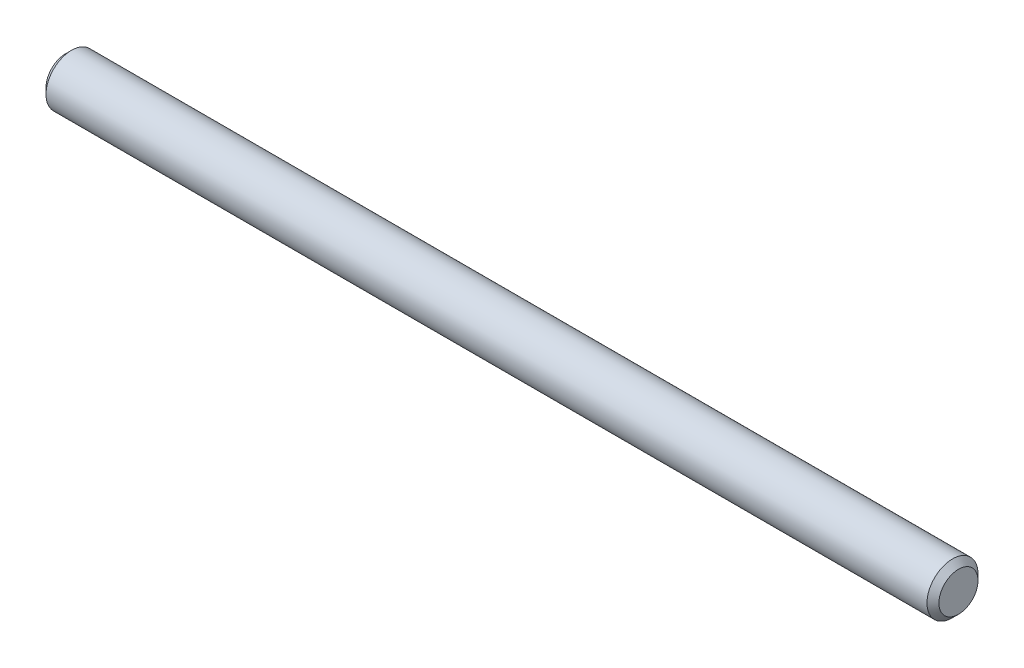
ISO-10303-21;
HEADER;
FILE_DESCRIPTION(('STEP AP214'),'2;1');
FILE_NAME('part.step','',(''),(''),'','','');
FILE_SCHEMA(('AUTOMOTIVE_DESIGN { 1 0 10303 214 1 1 1 1 }'));
ENDSEC;
DATA;
#1=APPLICATION_CONTEXT('core data for automotive mechanical design processes');
#2=APPLICATION_PROTOCOL_DEFINITION('international standard','automotive_design',2000,#1);
#3=PRODUCT_CONTEXT('',#1,'mechanical');
#4=PRODUCT('Part','Part','',(#3));
#5=PRODUCT_RELATED_PRODUCT_CATEGORY('part','',(#4));
#6=PRODUCT_DEFINITION_FORMATION('','',#4);
#7=PRODUCT_DEFINITION_CONTEXT('part definition',#1,'design');
#8=PRODUCT_DEFINITION('design','',#6,#7);
#9=PRODUCT_DEFINITION_SHAPE('','',#8);
#10=(LENGTH_UNIT() NAMED_UNIT(*) SI_UNIT(.MILLI.,.METRE.));
#11=(NAMED_UNIT(*) PLANE_ANGLE_UNIT() SI_UNIT($,.RADIAN.));
#12=(NAMED_UNIT(*) SI_UNIT($,.STERADIAN.) SOLID_ANGLE_UNIT());
#13=UNCERTAINTY_MEASURE_WITH_UNIT(LENGTH_MEASURE(1.E-05),#10,'distance_accuracy_value','');
#14=(GEOMETRIC_REPRESENTATION_CONTEXT(3) GLOBAL_UNCERTAINTY_ASSIGNED_CONTEXT((#13)) GLOBAL_UNIT_ASSIGNED_CONTEXT((#10,
#11,#12)) REPRESENTATION_CONTEXT('',''));
#15=CARTESIAN_POINT('',(0.,0.,0.));
#16=DIRECTION('',(0.,0.,1.));
#17=DIRECTION('',(1.,0.,0.));
#18=AXIS2_PLACEMENT_3D('',#15,#16,#17);
#19=CARTESIAN_POINT('',(-70.,0.,0.));
#20=DIRECTION('',(1.,0.,0.));
#21=DIRECTION('',(0.,0.,-1.));
#22=AXIS2_PLACEMENT_3D('',#19,#20,#21);
#23=CYLINDRICAL_SURFACE('',#22,4.);
#24=CARTESIAN_POINT('',(-69.0625,0.,0.));
#25=DIRECTION('',(1.,0.,0.));
#26=DIRECTION('',(0.,0.,-1.));
#27=AXIS2_PLACEMENT_3D('',#24,#25,#26);
#28=CIRCLE('',#27,4.);
#29=CARTESIAN_POINT('',(-69.0625,0.,-4.));
#30=VERTEX_POINT('',#29);
#31=EDGE_CURVE('E46',#30,#30,#28,.T.);
#32=ORIENTED_EDGE('',*,*,#31,.T.);
#33=EDGE_LOOP('',(#32));
#34=FACE_BOUND('',#33,.T.);
#35=CARTESIAN_POINT('',(69.0625,0.,0.));
#36=DIRECTION('',(1.,0.,0.));
#37=DIRECTION('',(0.,0.,-1.));
#38=AXIS2_PLACEMENT_3D('',#35,#36,#37);
#39=CIRCLE('',#38,4.);
#40=CARTESIAN_POINT('',(69.0625,0.,-4.));
#41=VERTEX_POINT('',#40);
#42=EDGE_CURVE('E50',#41,#41,#39,.F.);
#43=ORIENTED_EDGE('',*,*,#42,.T.);
#44=EDGE_LOOP('',(#43));
#45=FACE_BOUND('',#44,.T.);
#46=ADVANCED_FACE('F35',(#34,#45),#23,.T.);
#47=CARTESIAN_POINT('',(-70.,0.,0.));
#48=DIRECTION('',(1.,0.,0.));
#49=DIRECTION('',(0.,0.,-1.));
#50=AXIS2_PLACEMENT_3D('',#47,#48,#49);
#51=PLANE('',#50);
#52=CARTESIAN_POINT('',(-70.,0.,0.));
#53=DIRECTION('',(1.,0.,0.));
#54=DIRECTION('',(0.,0.,-1.));
#55=AXIS2_PLACEMENT_3D('',#52,#53,#54);
#56=CIRCLE('',#55,3.06250000000001);
#57=CARTESIAN_POINT('',(-70.,0.,-3.06250000000001));
#58=VERTEX_POINT('',#57);
#59=EDGE_CURVE('E42',#58,#58,#56,.F.);
#60=ORIENTED_EDGE('',*,*,#59,.T.);
#61=EDGE_LOOP('',(#60));
#62=FACE_BOUND('',#61,.T.);
#63=ADVANCED_FACE('F66',(#62),#51,.F.);
#64=CARTESIAN_POINT('',(70.,0.,0.));
#65=DIRECTION('',(1.,0.,0.));
#66=DIRECTION('',(0.,0.,-1.));
#67=AXIS2_PLACEMENT_3D('',#64,#65,#66);
#68=PLANE('',#67);
#69=CARTESIAN_POINT('',(70.,0.,0.));
#70=DIRECTION('',(1.,0.,0.));
#71=DIRECTION('',(0.,0.,-1.));
#72=AXIS2_PLACEMENT_3D('',#69,#70,#71);
#73=CIRCLE('',#72,3.06250000000001);
#74=CARTESIAN_POINT('',(70.,0.,-3.06250000000001));
#75=VERTEX_POINT('',#74);
#76=EDGE_CURVE('E10',#75,#75,#73,.T.);
#77=ORIENTED_EDGE('',*,*,#76,.T.);
#78=EDGE_LOOP('',(#77));
#79=FACE_BOUND('',#78,.T.);
#80=ADVANCED_FACE('F63',(#79),#68,.T.);
#81=CARTESIAN_POINT('',(-69.0625,0.,0.));
#82=DIRECTION('',(1.,0.,0.));
#83=DIRECTION('',(0.,0.,-1.));
#84=AXIS2_PLACEMENT_3D('',#81,#82,#83);
#85=CONICAL_SURFACE('',#84,4.,0.785398163397446);
#86=ORIENTED_EDGE('',*,*,#59,.F.);
#87=EDGE_LOOP('',(#86));
#88=FACE_BOUND('',#87,.T.);
#89=ORIENTED_EDGE('',*,*,#31,.F.);
#90=EDGE_LOOP('',(#89));
#91=FACE_BOUND('',#90,.T.);
#92=ADVANCED_FACE('F59',(#88,#91),#85,.T.);
#93=CARTESIAN_POINT('',(70.,0.,0.));
#94=DIRECTION('',(-1.,0.,0.));
#95=DIRECTION('',(0.,0.,1.));
#96=AXIS2_PLACEMENT_3D('',#93,#94,#95);
#97=CONICAL_SURFACE('',#96,3.06250000000001,0.785398163397454);
#98=ORIENTED_EDGE('',*,*,#42,.F.);
#99=EDGE_LOOP('',(#98));
#100=FACE_BOUND('',#99,.T.);
#101=ORIENTED_EDGE('',*,*,#76,.F.);
#102=EDGE_LOOP('',(#101));
#103=FACE_BOUND('',#102,.T.);
#104=ADVANCED_FACE('F37',(#100,#103),#97,.T.);
#105=CLOSED_SHELL('',(#46,#63,#80,#92,#104));
#106=MANIFOLD_SOLID_BREP('B2',#105);
#107=ADVANCED_BREP_SHAPE_REPRESENTATION('',(#18,#106),#14);
#108=SHAPE_DEFINITION_REPRESENTATION(#9,#107);
ENDSEC;
END-ISO-10303-21;
